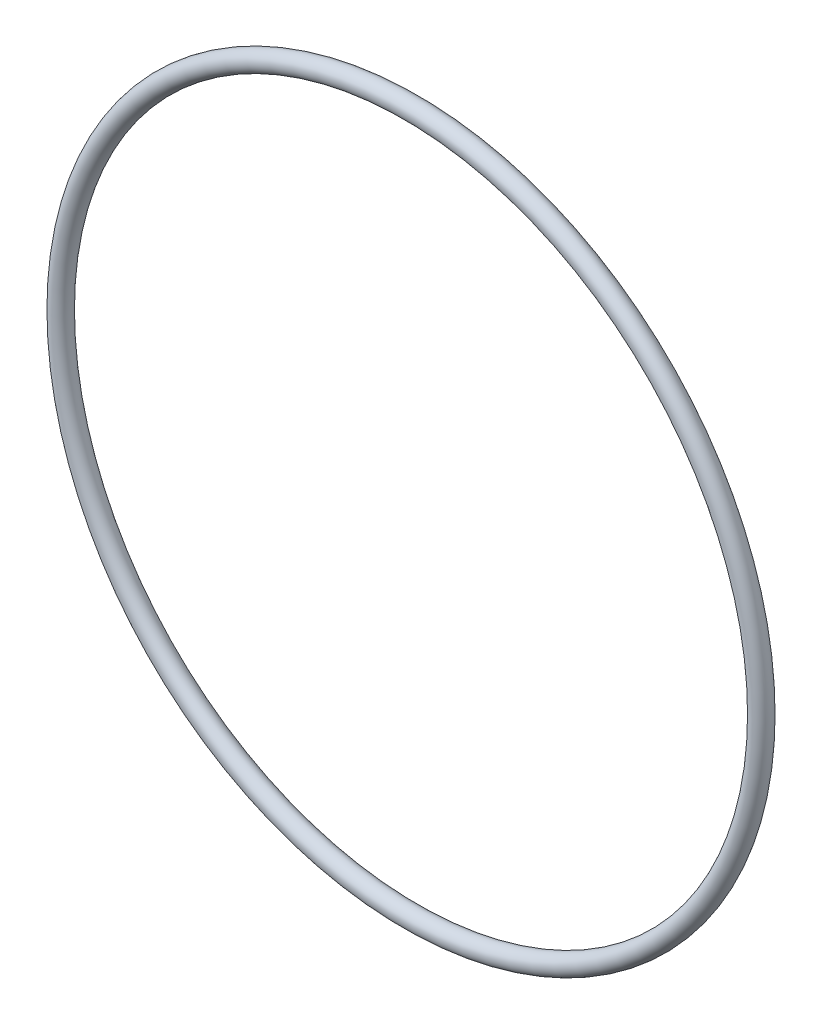
ISO-10303-21;
HEADER;
FILE_DESCRIPTION(('STEP AP214'),'2;1');
FILE_NAME('part.step','',(''),(''),'','','');
FILE_SCHEMA(('AUTOMOTIVE_DESIGN { 1 0 10303 214 1 1 1 1 }'));
ENDSEC;
DATA;
#1=APPLICATION_CONTEXT('core data for automotive mechanical design processes');
#2=APPLICATION_PROTOCOL_DEFINITION('international standard','automotive_design',2000,#1);
#3=PRODUCT_CONTEXT('',#1,'mechanical');
#4=PRODUCT('Part','Part','',(#3));
#5=PRODUCT_RELATED_PRODUCT_CATEGORY('part','',(#4));
#6=PRODUCT_DEFINITION_FORMATION('','',#4);
#7=PRODUCT_DEFINITION_CONTEXT('part definition',#1,'design');
#8=PRODUCT_DEFINITION('design','',#6,#7);
#9=PRODUCT_DEFINITION_SHAPE('','',#8);
#10=(LENGTH_UNIT() NAMED_UNIT(*) SI_UNIT(.MILLI.,.METRE.));
#11=(NAMED_UNIT(*) PLANE_ANGLE_UNIT() SI_UNIT($,.RADIAN.));
#12=(NAMED_UNIT(*) SI_UNIT($,.STERADIAN.) SOLID_ANGLE_UNIT());
#13=UNCERTAINTY_MEASURE_WITH_UNIT(LENGTH_MEASURE(1.E-05),#10,'distance_accuracy_value','');
#14=(GEOMETRIC_REPRESENTATION_CONTEXT(3) GLOBAL_UNCERTAINTY_ASSIGNED_CONTEXT((#13)) GLOBAL_UNIT_ASSIGNED_CONTEXT((#10,
#11,#12)) REPRESENTATION_CONTEXT('',''));
#15=CARTESIAN_POINT('',(0.,0.,0.));
#16=DIRECTION('',(0.,0.,1.));
#17=DIRECTION('',(1.,0.,0.));
#18=AXIS2_PLACEMENT_3D('',#15,#16,#17);
#19=CARTESIAN_POINT('',(0.,0.,0.));
#20=DIRECTION('',(0.,0.,1.));
#21=DIRECTION('',(1.,0.,0.));
#22=AXIS2_PLACEMENT_3D('',#19,#20,#21);
#23=TOROIDAL_SURFACE('',#22,63.4746,1.76529999999999);
#24=CARTESIAN_POINT('',(65.2399,0.,0.));
#25=VERTEX_POINT('',#24);
#26=VERTEX_LOOP('',#25);
#27=FACE_BOUND('',#26,.T.);
#28=ADVANCED_FACE('F35',(#27),#23,.T.);
#29=CLOSED_SHELL('',(#28));
#30=MANIFOLD_SOLID_BREP('B2',#29);
#31=ADVANCED_BREP_SHAPE_REPRESENTATION('',(#18,#30),#14);
#32=SHAPE_DEFINITION_REPRESENTATION(#9,#31);
ENDSEC;
END-ISO-10303-21;
